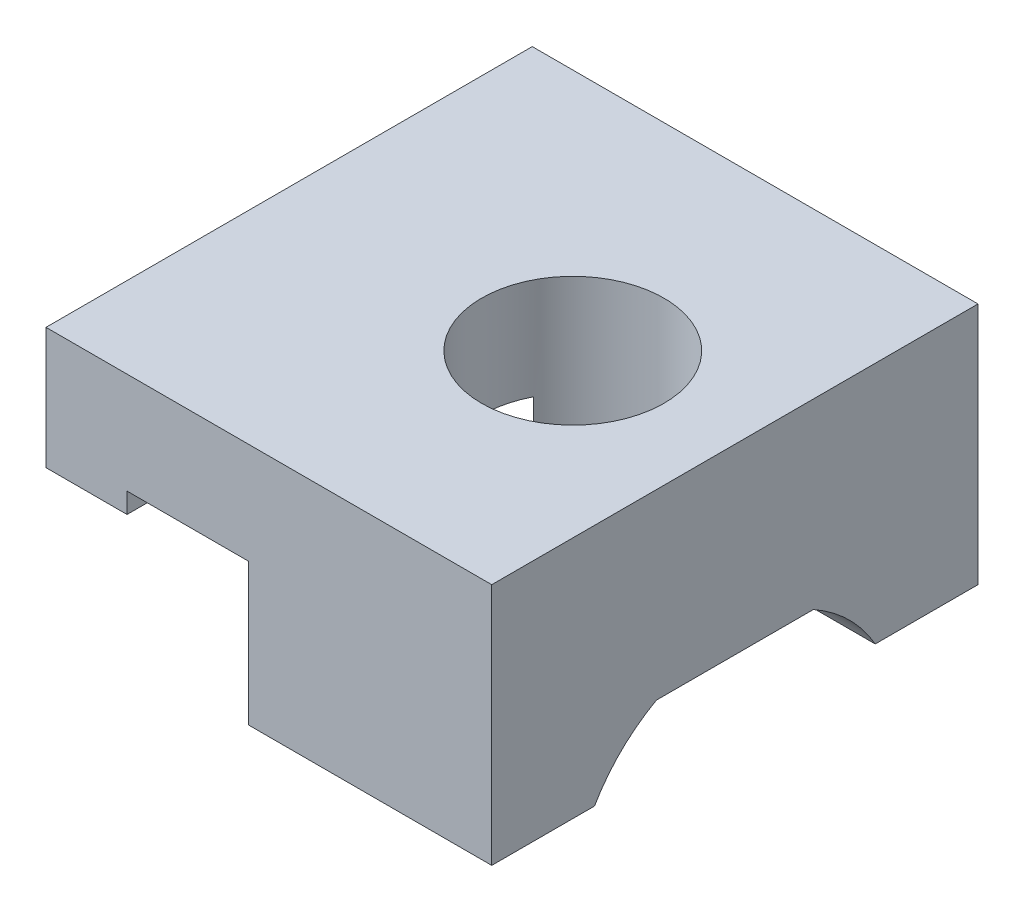
ISO-10303-21;
HEADER;
FILE_DESCRIPTION(('STEP AP214'),'2;1');
FILE_NAME('part.step','',(''),(''),'','','');
FILE_SCHEMA(('AUTOMOTIVE_DESIGN { 1 0 10303 214 1 1 1 1 }'));
ENDSEC;
DATA;
#1=APPLICATION_CONTEXT('core data for automotive mechanical design processes');
#2=APPLICATION_PROTOCOL_DEFINITION('international standard','automotive_design',2000,#1);
#3=PRODUCT_CONTEXT('',#1,'mechanical');
#4=PRODUCT('Part','Part','',(#3));
#5=PRODUCT_RELATED_PRODUCT_CATEGORY('part','',(#4));
#6=PRODUCT_DEFINITION_FORMATION('','',#4);
#7=PRODUCT_DEFINITION_CONTEXT('part definition',#1,'design');
#8=PRODUCT_DEFINITION('design','',#6,#7);
#9=PRODUCT_DEFINITION_SHAPE('','',#8);
#10=(LENGTH_UNIT() NAMED_UNIT(*) SI_UNIT(.MILLI.,.METRE.));
#11=(NAMED_UNIT(*) PLANE_ANGLE_UNIT() SI_UNIT($,.RADIAN.));
#12=(NAMED_UNIT(*) SI_UNIT($,.STERADIAN.) SOLID_ANGLE_UNIT());
#13=UNCERTAINTY_MEASURE_WITH_UNIT(LENGTH_MEASURE(1.E-05),#10,'distance_accuracy_value','');
#14=(GEOMETRIC_REPRESENTATION_CONTEXT(3) GLOBAL_UNCERTAINTY_ASSIGNED_CONTEXT((#13)) GLOBAL_UNIT_ASSIGNED_CONTEXT((#10,
#11,#12)) REPRESENTATION_CONTEXT('',''));
#15=CARTESIAN_POINT('',(0.,0.,0.));
#16=DIRECTION('',(0.,0.,1.));
#17=DIRECTION('',(1.,0.,0.));
#18=AXIS2_PLACEMENT_3D('',#15,#16,#17);
#19=CARTESIAN_POINT('',(-7.,-4.5,1.93649167310371));
#20=DIRECTION('',(0.,-1.,0.));
#21=DIRECTION('',(0.,0.,-1.));
#22=AXIS2_PLACEMENT_3D('',#19,#20,#21);
#23=PLANE('',#22);
#24=CARTESIAN_POINT('',(0.,-4.5,0.));
#25=DIRECTION('',(0.,-1.,0.));
#26=DIRECTION('',(0.,0.,-1.));
#27=AXIS2_PLACEMENT_3D('',#24,#25,#26);
#28=CIRCLE('',#27,2.25);
#29=CARTESIAN_POINT('',(1.14564392373896,-4.5,-1.93649167310371));
#30=VERTEX_POINT('',#29);
#31=CARTESIAN_POINT('',(1.14564392373896,-4.5,1.93649167310371));
#32=VERTEX_POINT('',#31);
#33=EDGE_CURVE('E264',#30,#32,#28,.T.);
#34=ORIENTED_EDGE('',*,*,#33,.F.);
#35=DIRECTION('',(1.,0.,0.));
#36=VECTOR('',#35,1.);
#37=CARTESIAN_POINT('',(-7.,-4.5,-1.93649167310371));
#38=LINE('',#37,#36);
#39=CARTESIAN_POINT('',(4.,-4.5,-1.93649167310371));
#40=VERTEX_POINT('',#39);
#41=EDGE_CURVE('E222',#30,#40,#38,.T.);
#42=ORIENTED_EDGE('',*,*,#41,.T.);
#43=DIRECTION('',(0.,0.,-1.));
#44=VECTOR('',#43,1.);
#45=CARTESIAN_POINT('',(4.,-4.5,1.93649167310371));
#46=LINE('',#45,#44);
#47=CARTESIAN_POINT('',(4.,-4.5,1.93649167310371));
#48=VERTEX_POINT('',#47);
#49=EDGE_CURVE('E203',#48,#40,#46,.T.);
#50=ORIENTED_EDGE('',*,*,#49,.F.);
#51=DIRECTION('',(1.,0.,0.));
#52=VECTOR('',#51,1.);
#53=CARTESIAN_POINT('',(-7.,-4.5,1.93649167310371));
#54=LINE('',#53,#52);
#55=EDGE_CURVE('E226',#32,#48,#54,.T.);
#56=ORIENTED_EDGE('',*,*,#55,.F.);
#57=EDGE_LOOP('',(#34,#42,#50,#56));
#58=FACE_BOUND('',#57,.T.);
#59=ADVANCED_FACE('F36',(#58),#23,.T.);
#60=CARTESIAN_POINT('',(-1.14564392373896,-4.5,1.93649167310371));
#61=VERTEX_POINT('',#60);
#62=CARTESIAN_POINT('',(-2.,-4.5,1.03077640640442));
#63=VERTEX_POINT('',#62);
#64=EDGE_CURVE('E51',#61,#63,#28,.T.);
#65=ORIENTED_EDGE('',*,*,#64,.F.);
#66=CARTESIAN_POINT('',(-2.,-4.5,1.93649167310371));
#67=VERTEX_POINT('',#66);
#68=EDGE_CURVE('E223',#67,#61,#54,.T.);
#69=ORIENTED_EDGE('',*,*,#68,.F.);
#70=DIRECTION('',(0.,0.,1.));
#71=VECTOR('',#70,1.);
#72=CARTESIAN_POINT('',(-2.,-4.5,1.93649167310371));
#73=LINE('',#72,#71);
#74=EDGE_CURVE('E178',#63,#67,#73,.T.);
#75=ORIENTED_EDGE('',*,*,#74,.F.);
#76=EDGE_LOOP('',(#65,#69,#75));
#77=FACE_BOUND('',#76,.T.);
#78=ADVANCED_FACE('F310',(#77),#23,.T.);
#79=CARTESIAN_POINT('',(-2.,-2.5,-6.));
#80=DIRECTION('',(1.,0.,0.));
#81=DIRECTION('',(0.,1.,0.));
#82=AXIS2_PLACEMENT_3D('',#79,#80,#81);
#83=PLANE('',#82);
#84=CARTESIAN_POINT('',(-2.,-4.5,-1.93649167310371));
#85=VERTEX_POINT('',#84);
#86=CARTESIAN_POINT('',(-2.,-4.5,-1.03077640640442));
#87=VERTEX_POINT('',#86);
#88=EDGE_CURVE('E180',#85,#87,#73,.T.);
#89=ORIENTED_EDGE('',*,*,#88,.T.);
#90=DIRECTION('',(0.,1.,0.));
#91=VECTOR('',#90,1.);
#92=CARTESIAN_POINT('',(-2.,-6.00000000000001,-1.03077640640442));
#93=LINE('',#92,#91);
#94=CARTESIAN_POINT('',(-2.,-2.5,-1.03077640640441));
#95=VERTEX_POINT('',#94);
#96=EDGE_CURVE('E11',#87,#95,#93,.T.);
#97=ORIENTED_EDGE('',*,*,#96,.T.);
#98=DIRECTION('',(0.,0.,1.));
#99=VECTOR('',#98,1.);
#100=CARTESIAN_POINT('',(-2.,-2.5,-6.));
#101=LINE('',#100,#99);
#102=CARTESIAN_POINT('',(-2.,-2.5,-6.));
#103=VERTEX_POINT('',#102);
#104=EDGE_CURVE('E161',#103,#95,#101,.T.);
#105=ORIENTED_EDGE('',*,*,#104,.F.);
#106=DIRECTION('',(0.,1.,0.));
#107=VECTOR('',#106,1.);
#108=CARTESIAN_POINT('',(-2.,-2.5,-6.));
#109=LINE('',#108,#107);
#110=CARTESIAN_POINT('',(-2.,-6.,-6.));
#111=VERTEX_POINT('',#110);
#112=EDGE_CURVE('E354',#111,#103,#109,.T.);
#113=ORIENTED_EDGE('',*,*,#112,.F.);
#114=DIRECTION('',(0.,0.,1.));
#115=VECTOR('',#114,1.);
#116=CARTESIAN_POINT('',(-2.,-6.,-6.));
#117=LINE('',#116,#115);
#118=CARTESIAN_POINT('',(-2.,-6.,-3.46410161513776));
#119=VERTEX_POINT('',#118);
#120=EDGE_CURVE('E168',#111,#119,#117,.T.);
#121=ORIENTED_EDGE('',*,*,#120,.T.);
#122=CARTESIAN_POINT('',(-1.99999999999999,-8.,0.));
#123=DIRECTION('',(1.,0.,0.));
#124=DIRECTION('',(0.,1.,0.));
#125=AXIS2_PLACEMENT_3D('',#122,#123,#124);
#126=CIRCLE('',#125,4.);
#127=EDGE_CURVE('E183',#119,#85,#126,.T.);
#128=ORIENTED_EDGE('',*,*,#127,.T.);
#129=EDGE_LOOP('',(#89,#97,#105,#113,#121,#128));
#130=FACE_BOUND('',#129,.T.);
#131=ADVANCED_FACE('F259',(#130),#83,.F.);
#132=CARTESIAN_POINT('',(-7.,-6.,-3.46410161513776));
#133=DIRECTION('',(0.,-1.,0.));
#134=DIRECTION('',(0.,0.,-1.));
#135=AXIS2_PLACEMENT_3D('',#132,#133,#134);
#136=PLANE('',#135);
#137=ORIENTED_EDGE('',*,*,#120,.F.);
#138=DIRECTION('',(1.,0.,0.));
#139=VECTOR('',#138,1.);
#140=CARTESIAN_POINT('',(-7.,-6.,-6.));
#141=LINE('',#140,#139);
#142=CARTESIAN_POINT('',(4.,-6.,-6.));
#143=VERTEX_POINT('',#142);
#144=EDGE_CURVE('E217',#111,#143,#141,.T.);
#145=ORIENTED_EDGE('',*,*,#144,.T.);
#146=DIRECTION('',(0.,0.,-1.));
#147=VECTOR('',#146,1.);
#148=CARTESIAN_POINT('',(4.,-6.,-3.46410161513776));
#149=LINE('',#148,#147);
#150=CARTESIAN_POINT('',(4.,-6.,-3.46410161513776));
#151=VERTEX_POINT('',#150);
#152=EDGE_CURVE('E185',#151,#143,#149,.T.);
#153=ORIENTED_EDGE('',*,*,#152,.F.);
#154=DIRECTION('',(1.,0.,0.));
#155=VECTOR('',#154,1.);
#156=CARTESIAN_POINT('',(-7.,-6.,-3.46410161513776));
#157=LINE('',#156,#155);
#158=EDGE_CURVE('E153',#119,#151,#157,.T.);
#159=ORIENTED_EDGE('',*,*,#158,.F.);
#160=EDGE_LOOP('',(#137,#145,#153,#159));
#161=FACE_BOUND('',#160,.T.);
#162=ADVANCED_FACE('F38',(#161),#136,.T.);
#163=CARTESIAN_POINT('',(-7.,-8.,0.));
#164=DIRECTION('',(1.,0.,0.));
#165=DIRECTION('',(0.,0.,-1.));
#166=AXIS2_PLACEMENT_3D('',#163,#164,#165);
#167=CYLINDRICAL_SURFACE('',#166,4.);
#168=CARTESIAN_POINT('',(-1.14564392373896,-4.5,-1.93649167310371));
#169=CARTESIAN_POINT('',(-1.09778182214494,-4.51566346914362,-1.96480190289853));
#170=CARTESIAN_POINT('',(-1.04876808380896,-4.53083235144372,-1.99140718341612));
#171=CARTESIAN_POINT('',(-0.948535738637303,-4.55981004117387,-2.04105824804769));
#172=CARTESIAN_POINT('',(-0.897315465528216,-4.57361779392164,-2.06410127965859));
#173=CARTESIAN_POINT('',(-0.740235928474006,-4.61249828958174,-2.12775059739055));
#174=CARTESIAN_POINT('',(-0.631299150677666,-4.63491174746705,-2.16267389014364));
#175=CARTESIAN_POINT('',(-0.407242869848007,-4.66967418381912,-2.21584535062321));
#176=CARTESIAN_POINT('',(-0.292094946403759,-4.68197181404216,-2.23400849937657));
#177=CARTESIAN_POINT('',(-0.0600221423039493,-4.69428407382752,-2.25219410842659));
#178=CARTESIAN_POINT('',(0.0568960345066939,-4.69433709649466,-2.25227327125629));
#179=CARTESIAN_POINT('',(0.278683306489306,-4.68278400494209,-2.2352071398586));
#180=CARTESIAN_POINT('',(0.38372628736418,-4.67217671296639,-2.21953743511027));
#181=CARTESIAN_POINT('',(0.589559404268582,-4.64222047475288,-2.17394808269468));
#182=CARTESIAN_POINT('',(0.690341202752449,-4.62285518612291,-2.14400178927906));
#183=CARTESIAN_POINT('',(0.85051141456575,-4.58574571493174,-2.0841351235281));
#184=CARTESIAN_POINT('',(0.911821823498329,-4.56989523569611,-2.05802973566078));
#185=CARTESIAN_POINT('',(1.03116792644957,-4.53625177561464,-2.0008852671472));
#186=CARTESIAN_POINT('',(1.08921773014296,-4.51846833118386,-1.96987009147454));
#187=CARTESIAN_POINT('',(1.14564392373896,-4.5,-1.93649167310371));
#188=B_SPLINE_CURVE_WITH_KNOTS('',3,(#168,#169,#170,#171,#172,#173,#174,#175,#176,#177,#178,
#179,#180,#181,#182,#183,#184,#185,#186,#187),.UNSPECIFIED.,.F.,.F.,(4,2,2,2,2,2,2,2,2,4),(0.,
0.173238589768801,0.346610376774275,0.694582142489005,1.04430950952511,1.39294028752847,
1.71169270050583,2.03104237431649,2.23627042588077,2.4405283606726),.UNSPECIFIED.);
#189=CARTESIAN_POINT('',(-1.14564392373896,-4.5,-1.93649167310371));
#190=VERTEX_POINT('',#189);
#191=EDGE_CURVE('E267',#190,#30,#188,.T.);
#192=ORIENTED_EDGE('',*,*,#191,.F.);
#193=EDGE_CURVE('E219',#85,#190,#38,.T.);
#194=ORIENTED_EDGE('',*,*,#193,.F.);
#195=ORIENTED_EDGE('',*,*,#127,.F.);
#196=ORIENTED_EDGE('',*,*,#158,.T.);
#197=CARTESIAN_POINT('',(4.,-8.,0.));
#198=DIRECTION('',(-1.,0.,0.));
#199=DIRECTION('',(0.,0.,-1.));
#200=AXIS2_PLACEMENT_3D('',#197,#198,#199);
#201=CIRCLE('',#200,4.);
#202=EDGE_CURVE('E206',#40,#151,#201,.T.);
#203=ORIENTED_EDGE('',*,*,#202,.F.);
#204=ORIENTED_EDGE('',*,*,#41,.F.);
#205=EDGE_LOOP('',(#192,#194,#195,#196,#203,#204));
#206=FACE_BOUND('',#205,.T.);
#207=ADVANCED_FACE('F254',(#206),#167,.F.);
#208=EDGE_CURVE('E263',#87,#190,#28,.T.);
#209=ORIENTED_EDGE('',*,*,#208,.F.);
#210=ORIENTED_EDGE('',*,*,#88,.F.);
#211=ORIENTED_EDGE('',*,*,#193,.T.);
#212=EDGE_LOOP('',(#209,#210,#211));
#213=FACE_BOUND('',#212,.T.);
#214=ADVANCED_FACE('F262',(#213),#23,.T.);
#215=CARTESIAN_POINT('',(-7.,-8.,0.));
#216=DIRECTION('',(1.,0.,0.));
#217=DIRECTION('',(0.,0.,-1.));
#218=AXIS2_PLACEMENT_3D('',#215,#216,#217);
#219=CYLINDRICAL_SURFACE('',#218,4.);
#220=CARTESIAN_POINT('',(1.14564392373896,-4.5,1.93649167310371));
#221=CARTESIAN_POINT('',(1.09778182214493,-4.51566346914362,1.96480190289853));
#222=CARTESIAN_POINT('',(1.04876808380896,-4.53083235144372,1.99140718341612));
#223=CARTESIAN_POINT('',(0.948535738637302,-4.55981004117387,2.04105824804769));
#224=CARTESIAN_POINT('',(0.897315465528216,-4.57361779392164,2.0641012796586));
#225=CARTESIAN_POINT('',(0.740235928474005,-4.61249828958174,2.12775059739055));
#226=CARTESIAN_POINT('',(0.631299150677665,-4.63491174746705,2.16267389014364));
#227=CARTESIAN_POINT('',(0.407242869848006,-4.66967418381912,2.21584535062321));
#228=CARTESIAN_POINT('',(0.292094946403757,-4.68197181404216,2.23400849937657));
#229=CARTESIAN_POINT('',(0.0600221423039475,-4.69428407382752,2.25219410842659));
#230=CARTESIAN_POINT('',(-0.0568960345066958,-4.69433709649466,2.25227327125629));
#231=CARTESIAN_POINT('',(-0.278683306489307,-4.68278400494209,2.2352071398586));
#232=CARTESIAN_POINT('',(-0.383726287364182,-4.67217671296639,2.21953743511027));
#233=CARTESIAN_POINT('',(-0.589559404268584,-4.64222047475288,2.17394808269468));
#234=CARTESIAN_POINT('',(-0.690341202752451,-4.62285518612291,2.14400178927906));
#235=CARTESIAN_POINT('',(-0.850511414565751,-4.58574571493174,2.0841351235281));
#236=CARTESIAN_POINT('',(-0.911821823498329,-4.56989523569611,2.05802973566078));
#237=CARTESIAN_POINT('',(-1.03116792644957,-4.53625177561464,2.0008852671472));
#238=CARTESIAN_POINT('',(-1.08921773014296,-4.51846833118386,1.96987009147454));
#239=CARTESIAN_POINT('',(-1.14564392373896,-4.5,1.93649167310371));
#240=B_SPLINE_CURVE_WITH_KNOTS('',3,(#220,#221,#222,#223,#224,#225,#226,#227,#228,#229,#230,
#231,#232,#233,#234,#235,#236,#237,#238,#239),.UNSPECIFIED.,.F.,.F.,(4,2,2,2,2,2,2,2,2,4),(0.,
0.173238589768801,0.346610376774276,0.694582142489005,1.04430950952511,1.39294028752847,
1.71169270050583,2.03104237431649,2.23627042588077,2.4405283606726),.UNSPECIFIED.);
#241=EDGE_CURVE('E265',#32,#61,#240,.T.);
#242=ORIENTED_EDGE('',*,*,#241,.F.);
#243=ORIENTED_EDGE('',*,*,#55,.T.);
#244=CARTESIAN_POINT('',(4.,-8.,0.));
#245=DIRECTION('',(-1.,0.,0.));
#246=DIRECTION('',(0.,0.,-1.));
#247=AXIS2_PLACEMENT_3D('',#244,#245,#246);
#248=CIRCLE('',#247,4.);
#249=CARTESIAN_POINT('',(4.,-6.,3.46410161513776));
#250=VERTEX_POINT('',#249);
#251=EDGE_CURVE('E200',#250,#48,#248,.T.);
#252=ORIENTED_EDGE('',*,*,#251,.F.);
#253=DIRECTION('',(1.,0.,0.));
#254=VECTOR('',#253,1.);
#255=CARTESIAN_POINT('',(-7.,-6.,3.46410161513776));
#256=LINE('',#255,#254);
#257=CARTESIAN_POINT('',(-2.,-6.,3.46410161513776));
#258=VERTEX_POINT('',#257);
#259=EDGE_CURVE('E227',#258,#250,#256,.T.);
#260=ORIENTED_EDGE('',*,*,#259,.F.);
#261=CARTESIAN_POINT('',(-1.99999999999999,-8.,0.));
#262=DIRECTION('',(1.,0.,0.));
#263=DIRECTION('',(0.,1.,0.));
#264=AXIS2_PLACEMENT_3D('',#261,#262,#263);
#265=CIRCLE('',#264,4.);
#266=EDGE_CURVE('E176',#67,#258,#265,.T.);
#267=ORIENTED_EDGE('',*,*,#266,.F.);
#268=ORIENTED_EDGE('',*,*,#68,.T.);
#269=EDGE_LOOP('',(#242,#243,#252,#260,#267,#268));
#270=FACE_BOUND('',#269,.T.);
#271=ADVANCED_FACE('F283',(#270),#219,.F.);
#272=CARTESIAN_POINT('',(-7.,-6.,6.));
#273=DIRECTION('',(0.,-1.,0.));
#274=DIRECTION('',(0.,0.,-1.));
#275=AXIS2_PLACEMENT_3D('',#272,#273,#274);
#276=PLANE('',#275);
#277=CARTESIAN_POINT('',(-2.,-6.,6.));
#278=VERTEX_POINT('',#277);
#279=EDGE_CURVE('E171',#258,#278,#117,.T.);
#280=ORIENTED_EDGE('',*,*,#279,.F.);
#281=ORIENTED_EDGE('',*,*,#259,.T.);
#282=DIRECTION('',(0.,0.,-1.));
#283=VECTOR('',#282,1.);
#284=CARTESIAN_POINT('',(4.,-6.,6.));
#285=LINE('',#284,#283);
#286=CARTESIAN_POINT('',(4.,-6.,6.));
#287=VERTEX_POINT('',#286);
#288=EDGE_CURVE('E197',#287,#250,#285,.T.);
#289=ORIENTED_EDGE('',*,*,#288,.F.);
#290=DIRECTION('',(1.,0.,0.));
#291=VECTOR('',#290,1.);
#292=CARTESIAN_POINT('',(-7.,-6.,6.));
#293=LINE('',#292,#291);
#294=EDGE_CURVE('E229',#278,#287,#293,.T.);
#295=ORIENTED_EDGE('',*,*,#294,.F.);
#296=EDGE_LOOP('',(#280,#281,#289,#295));
#297=FACE_BOUND('',#296,.T.);
#298=ADVANCED_FACE('F314',(#297),#276,.T.);
#299=CARTESIAN_POINT('',(-7.,0.,6.));
#300=DIRECTION('',(0.,0.,1.));
#301=DIRECTION('',(0.,-1.,0.));
#302=AXIS2_PLACEMENT_3D('',#299,#300,#301);
#303=PLANE('',#302);
#304=DIRECTION('',(-1.,0.,0.));
#305=VECTOR('',#304,1.);
#306=CARTESIAN_POINT('',(-7.,-3.,6.));
#307=LINE('',#306,#305);
#308=CARTESIAN_POINT('',(-5.,-3.,6.));
#309=VERTEX_POINT('',#308);
#310=CARTESIAN_POINT('',(-7.,-3.,6.));
#311=VERTEX_POINT('',#310);
#312=EDGE_CURVE('E59',#309,#311,#307,.T.);
#313=ORIENTED_EDGE('',*,*,#312,.F.);
#314=DIRECTION('',(0.,-1.,0.));
#315=VECTOR('',#314,1.);
#316=CARTESIAN_POINT('',(-5.,-3.,6.));
#317=LINE('',#316,#315);
#318=CARTESIAN_POINT('',(-5.,-2.5,6.));
#319=VERTEX_POINT('',#318);
#320=EDGE_CURVE('E347',#319,#309,#317,.T.);
#321=ORIENTED_EDGE('',*,*,#320,.F.);
#322=DIRECTION('',(-1.,0.,0.));
#323=VECTOR('',#322,1.);
#324=CARTESIAN_POINT('',(-5.,-2.5,6.));
#325=LINE('',#324,#323);
#326=CARTESIAN_POINT('',(-2.,-2.5,6.));
#327=VERTEX_POINT('',#326);
#328=EDGE_CURVE('E349',#327,#319,#325,.T.);
#329=ORIENTED_EDGE('',*,*,#328,.F.);
#330=DIRECTION('',(0.,1.,0.));
#331=VECTOR('',#330,1.);
#332=CARTESIAN_POINT('',(-2.,-2.5,6.));
#333=LINE('',#332,#331);
#334=EDGE_CURVE('E166',#278,#327,#333,.T.);
#335=ORIENTED_EDGE('',*,*,#334,.F.);
#336=ORIENTED_EDGE('',*,*,#294,.T.);
#337=DIRECTION('',(0.,-1.,0.));
#338=VECTOR('',#337,1.);
#339=CARTESIAN_POINT('',(4.,0.,6.));
#340=LINE('',#339,#338);
#341=CARTESIAN_POINT('',(4.,0.,6.));
#342=VERTEX_POINT('',#341);
#343=EDGE_CURVE('E194',#342,#287,#340,.T.);
#344=ORIENTED_EDGE('',*,*,#343,.F.);
#345=DIRECTION('',(1.,0.,0.));
#346=VECTOR('',#345,1.);
#347=CARTESIAN_POINT('',(-7.,0.,6.));
#348=LINE('',#347,#346);
#349=CARTESIAN_POINT('',(-7.,0.,6.));
#350=VERTEX_POINT('',#349);
#351=EDGE_CURVE('E231',#350,#342,#348,.T.);
#352=ORIENTED_EDGE('',*,*,#351,.F.);
#353=DIRECTION('',(0.,-1.,0.));
#354=VECTOR('',#353,1.);
#355=CARTESIAN_POINT('',(-7.,0.,6.));
#356=LINE('',#355,#354);
#357=EDGE_CURVE('E214',#350,#311,#356,.T.);
#358=ORIENTED_EDGE('',*,*,#357,.T.);
#359=EDGE_LOOP('',(#313,#321,#329,#335,#336,#344,#352,#358));
#360=FACE_BOUND('',#359,.T.);
#361=ADVANCED_FACE('F352',(#360),#303,.T.);
#362=CARTESIAN_POINT('',(-7.,0.,-6.));
#363=DIRECTION('',(0.,1.,0.));
#364=DIRECTION('',(0.,0.,1.));
#365=AXIS2_PLACEMENT_3D('',#362,#363,#364);
#366=PLANE('',#365);
#367=CARTESIAN_POINT('',(0.,0.,0.));
#368=DIRECTION('',(0.,1.,0.));
#369=DIRECTION('',(0.,0.,1.));
#370=AXIS2_PLACEMENT_3D('',#367,#368,#369);
#371=CIRCLE('',#370,2.25);
#372=CARTESIAN_POINT('',(0.,0.,2.25));
#373=VERTEX_POINT('',#372);
#374=EDGE_CURVE('E162',#373,#373,#371,.T.);
#375=ORIENTED_EDGE('',*,*,#374,.F.);
#376=EDGE_LOOP('',(#375));
#377=FACE_BOUND('',#376,.T.);
#378=ORIENTED_EDGE('',*,*,#351,.T.);
#379=DIRECTION('',(0.,0.,1.));
#380=VECTOR('',#379,1.);
#381=CARTESIAN_POINT('',(4.,0.,-6.));
#382=LINE('',#381,#380);
#383=CARTESIAN_POINT('',(4.,0.,-6.));
#384=VERTEX_POINT('',#383);
#385=EDGE_CURVE('E191',#384,#342,#382,.T.);
#386=ORIENTED_EDGE('',*,*,#385,.F.);
#387=DIRECTION('',(1.,0.,0.));
#388=VECTOR('',#387,1.);
#389=CARTESIAN_POINT('',(-7.,0.,-6.));
#390=LINE('',#389,#388);
#391=CARTESIAN_POINT('',(-7.,0.,-6.));
#392=VERTEX_POINT('',#391);
#393=EDGE_CURVE('E233',#392,#384,#390,.T.);
#394=ORIENTED_EDGE('',*,*,#393,.F.);
#395=DIRECTION('',(0.,0.,1.));
#396=VECTOR('',#395,1.);
#397=CARTESIAN_POINT('',(-7.,0.,-6.));
#398=LINE('',#397,#396);
#399=EDGE_CURVE('E211',#392,#350,#398,.T.);
#400=ORIENTED_EDGE('',*,*,#399,.T.);
#401=EDGE_LOOP('',(#378,#386,#394,#400));
#402=FACE_BOUND('',#401,.T.);
#403=ADVANCED_FACE('F362',(#377,#402),#366,.T.);
#404=CARTESIAN_POINT('',(-7.,-6.,-6.));
#405=DIRECTION('',(0.,0.,-1.));
#406=DIRECTION('',(0.,1.,0.));
#407=AXIS2_PLACEMENT_3D('',#404,#405,#406);
#408=PLANE('',#407);
#409=DIRECTION('',(-1.,0.,0.));
#410=VECTOR('',#409,1.);
#411=CARTESIAN_POINT('',(-7.,-3.,-6.));
#412=LINE('',#411,#410);
#413=CARTESIAN_POINT('',(-5.,-3.,-6.));
#414=VERTEX_POINT('',#413);
#415=CARTESIAN_POINT('',(-7.,-3.,-6.));
#416=VERTEX_POINT('',#415);
#417=EDGE_CURVE('E333',#414,#416,#412,.T.);
#418=ORIENTED_EDGE('',*,*,#417,.T.);
#419=DIRECTION('',(0.,1.,0.));
#420=VECTOR('',#419,1.);
#421=CARTESIAN_POINT('',(-7.,-6.,-6.));
#422=LINE('',#421,#420);
#423=EDGE_CURVE('E209',#416,#392,#422,.T.);
#424=ORIENTED_EDGE('',*,*,#423,.T.);
#425=ORIENTED_EDGE('',*,*,#393,.T.);
#426=DIRECTION('',(0.,1.,0.));
#427=VECTOR('',#426,1.);
#428=CARTESIAN_POINT('',(4.,-6.,-6.));
#429=LINE('',#428,#427);
#430=EDGE_CURVE('E188',#143,#384,#429,.T.);
#431=ORIENTED_EDGE('',*,*,#430,.F.);
#432=ORIENTED_EDGE('',*,*,#144,.F.);
#433=ORIENTED_EDGE('',*,*,#112,.T.);
#434=DIRECTION('',(-1.,0.,0.));
#435=VECTOR('',#434,1.);
#436=CARTESIAN_POINT('',(-5.,-2.5,-6.));
#437=LINE('',#436,#435);
#438=CARTESIAN_POINT('',(-5.,-2.5,-6.));
#439=VERTEX_POINT('',#438);
#440=EDGE_CURVE('E339',#103,#439,#437,.T.);
#441=ORIENTED_EDGE('',*,*,#440,.T.);
#442=DIRECTION('',(0.,-1.,0.));
#443=VECTOR('',#442,1.);
#444=CARTESIAN_POINT('',(-5.,-3.,-6.));
#445=LINE('',#444,#443);
#446=EDGE_CURVE('E334',#439,#414,#445,.T.);
#447=ORIENTED_EDGE('',*,*,#446,.T.);
#448=EDGE_LOOP('',(#418,#424,#425,#431,#432,#433,#441,#447));
#449=FACE_BOUND('',#448,.T.);
#450=ADVANCED_FACE('F244',(#449),#408,.T.);
#451=CARTESIAN_POINT('',(-7.,-8.,0.));
#452=DIRECTION('',(1.,0.,0.));
#453=DIRECTION('',(0.,0.,-1.));
#454=AXIS2_PLACEMENT_3D('',#451,#452,#453);
#455=PLANE('',#454);
#456=ORIENTED_EDGE('',*,*,#423,.F.);
#457=DIRECTION('',(0.,0.,1.));
#458=VECTOR('',#457,1.);
#459=CARTESIAN_POINT('',(-7.,-3.,-6.));
#460=LINE('',#459,#458);
#461=EDGE_CURVE('E179',#416,#311,#460,.T.);
#462=ORIENTED_EDGE('',*,*,#461,.T.);
#463=ORIENTED_EDGE('',*,*,#357,.F.);
#464=ORIENTED_EDGE('',*,*,#399,.F.);
#465=EDGE_LOOP('',(#456,#462,#463,#464));
#466=FACE_BOUND('',#465,.T.);
#467=ADVANCED_FACE('F304',(#466),#455,.F.);
#468=CARTESIAN_POINT('',(4.,-8.,0.));
#469=DIRECTION('',(1.,0.,0.));
#470=DIRECTION('',(0.,0.,-1.));
#471=AXIS2_PLACEMENT_3D('',#468,#469,#470);
#472=PLANE('',#471);
#473=ORIENTED_EDGE('',*,*,#152,.T.);
#474=ORIENTED_EDGE('',*,*,#430,.T.);
#475=ORIENTED_EDGE('',*,*,#385,.T.);
#476=ORIENTED_EDGE('',*,*,#343,.T.);
#477=ORIENTED_EDGE('',*,*,#288,.T.);
#478=ORIENTED_EDGE('',*,*,#251,.T.);
#479=ORIENTED_EDGE('',*,*,#49,.T.);
#480=ORIENTED_EDGE('',*,*,#202,.T.);
#481=EDGE_LOOP('',(#473,#474,#475,#476,#477,#478,#479,#480));
#482=FACE_BOUND('',#481,.T.);
#483=ADVANCED_FACE('F248',(#482),#472,.T.);
#484=CARTESIAN_POINT('',(-7.,-3.,-6.));
#485=DIRECTION('',(0.,1.,0.));
#486=DIRECTION('',(0.,0.,1.));
#487=AXIS2_PLACEMENT_3D('',#484,#485,#486);
#488=PLANE('',#487);
#489=ORIENTED_EDGE('',*,*,#461,.F.);
#490=ORIENTED_EDGE('',*,*,#417,.F.);
#491=DIRECTION('',(0.,0.,1.));
#492=VECTOR('',#491,1.);
#493=CARTESIAN_POINT('',(-5.,-3.,-6.));
#494=LINE('',#493,#492);
#495=EDGE_CURVE('E343',#414,#309,#494,.T.);
#496=ORIENTED_EDGE('',*,*,#495,.T.);
#497=ORIENTED_EDGE('',*,*,#312,.T.);
#498=EDGE_LOOP('',(#489,#490,#496,#497));
#499=FACE_BOUND('',#498,.T.);
#500=ADVANCED_FACE('F290',(#499),#488,.F.);
#501=CARTESIAN_POINT('',(-5.,-3.,-6.));
#502=DIRECTION('',(-1.,0.,0.));
#503=DIRECTION('',(0.,0.,1.));
#504=AXIS2_PLACEMENT_3D('',#501,#502,#503);
#505=PLANE('',#504);
#506=ORIENTED_EDGE('',*,*,#495,.F.);
#507=ORIENTED_EDGE('',*,*,#446,.F.);
#508=DIRECTION('',(0.,0.,1.));
#509=VECTOR('',#508,1.);
#510=CARTESIAN_POINT('',(-5.,-2.5,-6.));
#511=LINE('',#510,#509);
#512=EDGE_CURVE('E170',#439,#319,#511,.T.);
#513=ORIENTED_EDGE('',*,*,#512,.T.);
#514=ORIENTED_EDGE('',*,*,#320,.T.);
#515=EDGE_LOOP('',(#506,#507,#513,#514));
#516=FACE_BOUND('',#515,.T.);
#517=ADVANCED_FACE('F294',(#516),#505,.F.);
#518=CARTESIAN_POINT('',(-5.,-2.5,-6.));
#519=DIRECTION('',(0.,1.,0.));
#520=DIRECTION('',(0.,0.,1.));
#521=AXIS2_PLACEMENT_3D('',#518,#519,#520);
#522=PLANE('',#521);
#523=ORIENTED_EDGE('',*,*,#104,.T.);
#524=CARTESIAN_POINT('',(0.,-2.5,0.));
#525=DIRECTION('',(0.,1.,0.));
#526=DIRECTION('',(0.,0.,1.));
#527=AXIS2_PLACEMENT_3D('',#524,#525,#526);
#528=CIRCLE('',#527,2.25);
#529=CARTESIAN_POINT('',(-2.,-2.5,1.03077640640442));
#530=VERTEX_POINT('',#529);
#531=EDGE_CURVE('E149',#95,#530,#528,.T.);
#532=ORIENTED_EDGE('',*,*,#531,.T.);
#533=EDGE_CURVE('E158',#530,#327,#101,.T.);
#534=ORIENTED_EDGE('',*,*,#533,.T.);
#535=ORIENTED_EDGE('',*,*,#328,.T.);
#536=ORIENTED_EDGE('',*,*,#512,.F.);
#537=ORIENTED_EDGE('',*,*,#440,.F.);
#538=EDGE_LOOP('',(#523,#532,#534,#535,#536,#537));
#539=FACE_BOUND('',#538,.T.);
#540=ADVANCED_FACE('F156',(#539),#522,.F.);
#541=ORIENTED_EDGE('',*,*,#533,.F.);
#542=DIRECTION('',(0.,1.,0.));
#543=VECTOR('',#542,1.);
#544=CARTESIAN_POINT('',(-2.,-6.00000000000001,1.03077640640442));
#545=LINE('',#544,#543);
#546=EDGE_CURVE('E44',#530,#63,#545,.F.);
#547=ORIENTED_EDGE('',*,*,#546,.T.);
#548=ORIENTED_EDGE('',*,*,#74,.T.);
#549=ORIENTED_EDGE('',*,*,#266,.T.);
#550=ORIENTED_EDGE('',*,*,#279,.T.);
#551=ORIENTED_EDGE('',*,*,#334,.T.);
#552=EDGE_LOOP('',(#541,#547,#548,#549,#550,#551));
#553=FACE_BOUND('',#552,.T.);
#554=ADVANCED_FACE('F164',(#553),#83,.F.);
#555=CARTESIAN_POINT('',(0.,-6.,0.));
#556=DIRECTION('',(0.,1.,0.));
#557=DIRECTION('',(0.,0.,1.));
#558=AXIS2_PLACEMENT_3D('',#555,#556,#557);
#559=CYLINDRICAL_SURFACE('',#558,2.25);
#560=ORIENTED_EDGE('',*,*,#191,.T.);
#561=ORIENTED_EDGE('',*,*,#33,.T.);
#562=ORIENTED_EDGE('',*,*,#241,.T.);
#563=ORIENTED_EDGE('',*,*,#64,.T.);
#564=ORIENTED_EDGE('',*,*,#546,.F.);
#565=ORIENTED_EDGE('',*,*,#531,.F.);
#566=ORIENTED_EDGE('',*,*,#96,.F.);
#567=ORIENTED_EDGE('',*,*,#208,.T.);
#568=EDGE_LOOP('',(#560,#561,#562,#563,#564,#565,#566,#567));
#569=FACE_BOUND('',#568,.T.);
#570=ORIENTED_EDGE('',*,*,#374,.T.);
#571=EDGE_LOOP('',(#570));
#572=FACE_BOUND('',#571,.T.);
#573=ADVANCED_FACE('F147',(#569,#572),#559,.F.);
#574=CLOSED_SHELL('',(#59,#78,#131,#162,#207,#214,#271,#298,#361,#403,#450,#467,#483,#500,#517,
#540,#554,#573));
#575=MANIFOLD_SOLID_BREP('B2',#574);
#576=ADVANCED_BREP_SHAPE_REPRESENTATION('',(#18,#575),#14);
#577=SHAPE_DEFINITION_REPRESENTATION(#9,#576);
ENDSEC;
END-ISO-10303-21;
